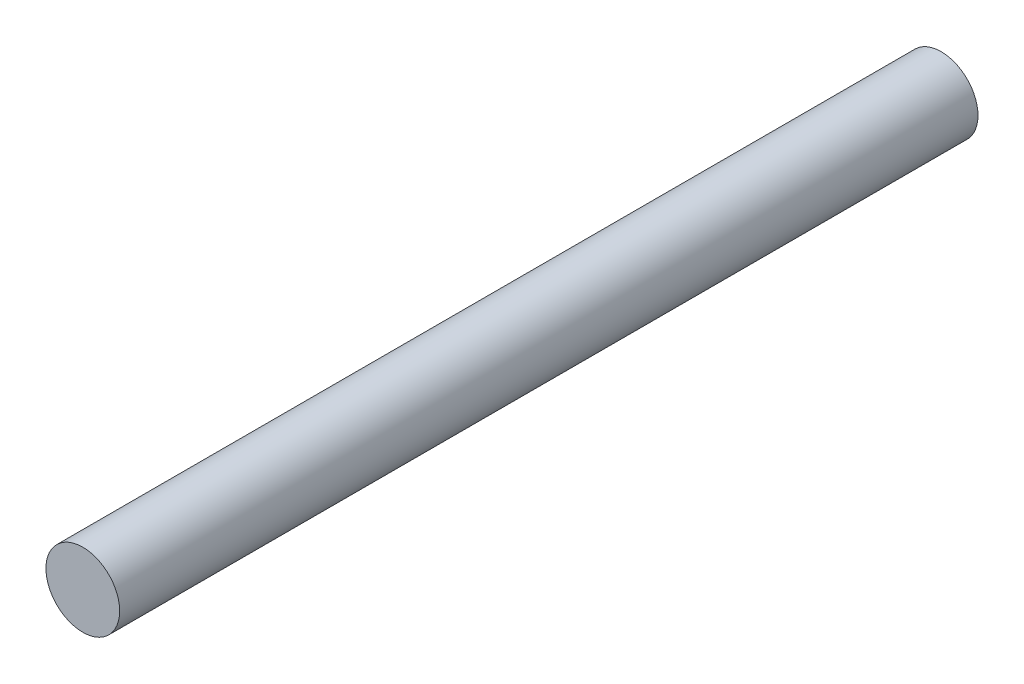
ISO-10303-21;
HEADER;
FILE_DESCRIPTION(('STEP AP214'),'2;1');
FILE_NAME('part.step','',(''),(''),'','','');
FILE_SCHEMA(('AUTOMOTIVE_DESIGN { 1 0 10303 214 1 1 1 1 }'));
ENDSEC;
DATA;
#1=APPLICATION_CONTEXT('core data for automotive mechanical design processes');
#2=APPLICATION_PROTOCOL_DEFINITION('international standard','automotive_design',2000,#1);
#3=PRODUCT_CONTEXT('',#1,'mechanical');
#4=PRODUCT('Part','Part','',(#3));
#5=PRODUCT_RELATED_PRODUCT_CATEGORY('part','',(#4));
#6=PRODUCT_DEFINITION_FORMATION('','',#4);
#7=PRODUCT_DEFINITION_CONTEXT('part definition',#1,'design');
#8=PRODUCT_DEFINITION('design','',#6,#7);
#9=PRODUCT_DEFINITION_SHAPE('','',#8);
#10=(LENGTH_UNIT() NAMED_UNIT(*) SI_UNIT(.MILLI.,.METRE.));
#11=(NAMED_UNIT(*) PLANE_ANGLE_UNIT() SI_UNIT($,.RADIAN.));
#12=(NAMED_UNIT(*) SI_UNIT($,.STERADIAN.) SOLID_ANGLE_UNIT());
#13=UNCERTAINTY_MEASURE_WITH_UNIT(LENGTH_MEASURE(1.E-05),#10,'distance_accuracy_value','');
#14=(GEOMETRIC_REPRESENTATION_CONTEXT(3) GLOBAL_UNCERTAINTY_ASSIGNED_CONTEXT((#13)) GLOBAL_UNIT_ASSIGNED_CONTEXT((#10,
#11,#12)) REPRESENTATION_CONTEXT('',''));
#15=CARTESIAN_POINT('',(0.,0.,0.));
#16=DIRECTION('',(0.,0.,1.));
#17=DIRECTION('',(1.,0.,0.));
#18=AXIS2_PLACEMENT_3D('',#15,#16,#17);
#19=CARTESIAN_POINT('',(0.,0.,69.85));
#20=DIRECTION('',(0.,0.,-1.));
#21=DIRECTION('',(-1.,0.,0.));
#22=AXIS2_PLACEMENT_3D('',#19,#20,#21);
#23=CYLINDRICAL_SURFACE('',#22,3.);
#24=CARTESIAN_POINT('',(0.,0.,69.85));
#25=DIRECTION('',(0.,0.,1.));
#26=DIRECTION('',(1.,0.,0.));
#27=AXIS2_PLACEMENT_3D('',#24,#25,#26);
#28=CIRCLE('',#27,3.);
#29=CARTESIAN_POINT('',(3.,0.,69.85));
#30=VERTEX_POINT('',#29);
#31=EDGE_CURVE('E10',#30,#30,#28,.T.);
#32=ORIENTED_EDGE('',*,*,#31,.F.);
#33=EDGE_LOOP('',(#32));
#34=FACE_BOUND('',#33,.T.);
#35=CARTESIAN_POINT('',(0.,0.,0.));
#36=DIRECTION('',(0.,0.,1.));
#37=DIRECTION('',(1.,0.,0.));
#38=AXIS2_PLACEMENT_3D('',#35,#36,#37);
#39=CIRCLE('',#38,3.);
#40=CARTESIAN_POINT('',(3.,0.,0.));
#41=VERTEX_POINT('',#40);
#42=EDGE_CURVE('E40',#41,#41,#39,.T.);
#43=ORIENTED_EDGE('',*,*,#42,.T.);
#44=EDGE_LOOP('',(#43));
#45=FACE_BOUND('',#44,.T.);
#46=ADVANCED_FACE('F37',(#34,#45),#23,.T.);
#47=CARTESIAN_POINT('',(0.,0.,69.85));
#48=DIRECTION('',(0.,0.,1.));
#49=DIRECTION('',(1.,0.,0.));
#50=AXIS2_PLACEMENT_3D('',#47,#48,#49);
#51=PLANE('',#50);
#52=ORIENTED_EDGE('',*,*,#31,.T.);
#53=EDGE_LOOP('',(#52));
#54=FACE_BOUND('',#53,.T.);
#55=ADVANCED_FACE('F54',(#54),#51,.T.);
#56=CARTESIAN_POINT('',(0.,0.,0.));
#57=DIRECTION('',(0.,0.,1.));
#58=DIRECTION('',(1.,0.,0.));
#59=AXIS2_PLACEMENT_3D('',#56,#57,#58);
#60=PLANE('',#59);
#61=ORIENTED_EDGE('',*,*,#42,.F.);
#62=EDGE_LOOP('',(#61));
#63=FACE_BOUND('',#62,.T.);
#64=ADVANCED_FACE('F52',(#63),#60,.F.);
#65=CLOSED_SHELL('',(#46,#55,#64));
#66=MANIFOLD_SOLID_BREP('B2',#65);
#67=ADVANCED_BREP_SHAPE_REPRESENTATION('',(#18,#66),#14);
#68=SHAPE_DEFINITION_REPRESENTATION(#9,#67);
ENDSEC;
END-ISO-10303-21;
